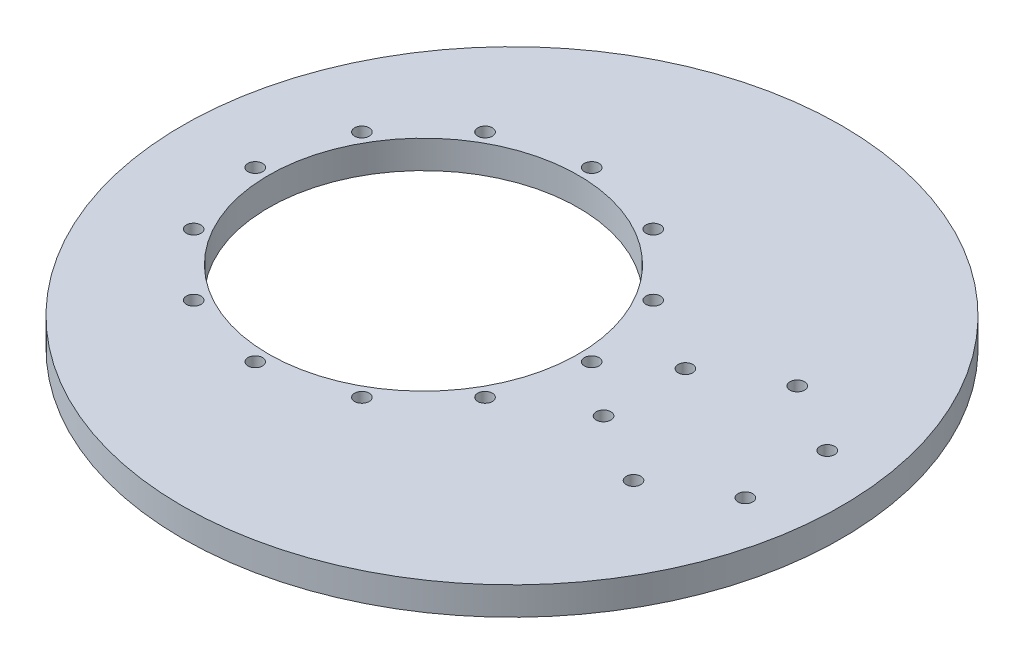
ISO-10303-21;
HEADER;
FILE_DESCRIPTION(('STEP AP214'),'2;1');
FILE_NAME('part.step','',(''),(''),'','','');
FILE_SCHEMA(('AUTOMOTIVE_DESIGN { 1 0 10303 214 1 1 1 1 }'));
ENDSEC;
DATA;
#1=APPLICATION_CONTEXT('core data for automotive mechanical design processes');
#2=APPLICATION_PROTOCOL_DEFINITION('international standard','automotive_design',2000,#1);
#3=PRODUCT_CONTEXT('',#1,'mechanical');
#4=PRODUCT('Part','Part','',(#3));
#5=PRODUCT_RELATED_PRODUCT_CATEGORY('part','',(#4));
#6=PRODUCT_DEFINITION_FORMATION('','',#4);
#7=PRODUCT_DEFINITION_CONTEXT('part definition',#1,'design');
#8=PRODUCT_DEFINITION('design','',#6,#7);
#9=PRODUCT_DEFINITION_SHAPE('','',#8);
#10=(LENGTH_UNIT() NAMED_UNIT(*) SI_UNIT(.MILLI.,.METRE.));
#11=(NAMED_UNIT(*) PLANE_ANGLE_UNIT() SI_UNIT($,.RADIAN.));
#12=(NAMED_UNIT(*) SI_UNIT($,.STERADIAN.) SOLID_ANGLE_UNIT());
#13=UNCERTAINTY_MEASURE_WITH_UNIT(LENGTH_MEASURE(1.E-05),#10,'distance_accuracy_value','');
#14=(GEOMETRIC_REPRESENTATION_CONTEXT(3) GLOBAL_UNCERTAINTY_ASSIGNED_CONTEXT((#13)) GLOBAL_UNIT_ASSIGNED_CONTEXT((#10,
#11,#12)) REPRESENTATION_CONTEXT('',''));
#15=CARTESIAN_POINT('',(0.,0.,0.));
#16=DIRECTION('',(0.,0.,1.));
#17=DIRECTION('',(1.,0.,0.));
#18=AXIS2_PLACEMENT_3D('',#15,#16,#17);
#19=CARTESIAN_POINT('',(0.,6.35,0.));
#20=DIRECTION('',(0.,-1.,0.));
#21=DIRECTION('',(0.,0.,-1.));
#22=AXIS2_PLACEMENT_3D('',#19,#20,#21);
#23=CYLINDRICAL_SURFACE('',#22,35.);
#24=CARTESIAN_POINT('',(0.,6.35,0.));
#25=DIRECTION('',(0.,1.,0.));
#26=DIRECTION('',(0.,0.,1.));
#27=AXIS2_PLACEMENT_3D('',#24,#25,#26);
#28=CIRCLE('',#27,35.);
#29=CARTESIAN_POINT('',(0.,6.35,35.));
#30=VERTEX_POINT('',#29);
#31=EDGE_CURVE('E48',#30,#30,#28,.T.);
#32=ORIENTED_EDGE('',*,*,#31,.T.);
#33=EDGE_LOOP('',(#32));
#34=FACE_BOUND('',#33,.T.);
#35=CARTESIAN_POINT('',(0.,0.,0.));
#36=DIRECTION('',(0.,1.,0.));
#37=DIRECTION('',(0.,0.,1.));
#38=AXIS2_PLACEMENT_3D('',#35,#36,#37);
#39=CIRCLE('',#38,35.);
#40=CARTESIAN_POINT('',(0.,0.,35.));
#41=VERTEX_POINT('',#40);
#42=EDGE_CURVE('E55',#41,#41,#39,.T.);
#43=ORIENTED_EDGE('',*,*,#42,.F.);
#44=EDGE_LOOP('',(#43));
#45=FACE_BOUND('',#44,.T.);
#46=ADVANCED_FACE('F41',(#34,#45),#23,.F.);
#47=CARTESIAN_POINT('',(20.,6.35,0.));
#48=DIRECTION('',(0.,-1.,0.));
#49=DIRECTION('',(0.,0.,-1.));
#50=AXIS2_PLACEMENT_3D('',#47,#48,#49);
#51=CYLINDRICAL_SURFACE('',#50,74.45);
#52=CARTESIAN_POINT('',(20.,6.35,0.));
#53=DIRECTION('',(0.,1.,0.));
#54=DIRECTION('',(0.,0.,1.));
#55=AXIS2_PLACEMENT_3D('',#52,#53,#54);
#56=CIRCLE('',#55,74.45);
#57=CARTESIAN_POINT('',(20.,6.35,74.45));
#58=VERTEX_POINT('',#57);
#59=EDGE_CURVE('E10',#58,#58,#56,.T.);
#60=ORIENTED_EDGE('',*,*,#59,.F.);
#61=EDGE_LOOP('',(#60));
#62=FACE_BOUND('',#61,.T.);
#63=CARTESIAN_POINT('',(20.,0.,0.));
#64=DIRECTION('',(0.,1.,0.));
#65=DIRECTION('',(0.,0.,1.));
#66=AXIS2_PLACEMENT_3D('',#63,#64,#65);
#67=CIRCLE('',#66,74.45);
#68=CARTESIAN_POINT('',(20.,0.,74.45));
#69=VERTEX_POINT('',#68);
#70=EDGE_CURVE('E44',#69,#69,#67,.T.);
#71=ORIENTED_EDGE('',*,*,#70,.T.);
#72=EDGE_LOOP('',(#71));
#73=FACE_BOUND('',#72,.T.);
#74=ADVANCED_FACE('F213',(#62,#73),#51,.T.);
#75=CARTESIAN_POINT('',(0.,6.35,0.));
#76=DIRECTION('',(0.,1.,0.));
#77=DIRECTION('',(0.,0.,1.));
#78=AXIS2_PLACEMENT_3D('',#75,#76,#77);
#79=PLANE('',#78);
#80=CARTESIAN_POINT('',(0.,6.35,-38.));
#81=DIRECTION('',(0.,-1.,0.));
#82=DIRECTION('',(0.,0.,-1.));
#83=AXIS2_PLACEMENT_3D('',#80,#81,#82);
#84=CIRCLE('',#83,1.65);
#85=CARTESIAN_POINT('',(0.,6.35,-39.65));
#86=VERTEX_POINT('',#85);
#87=EDGE_CURVE('E164',#86,#86,#84,.T.);
#88=ORIENTED_EDGE('',*,*,#87,.T.);
#89=EDGE_LOOP('',(#88));
#90=FACE_BOUND('',#89,.T.);
#91=CARTESIAN_POINT('',(-19.,6.35,-32.9089653438087));
#92=DIRECTION('',(0.,-1.,0.));
#93=DIRECTION('',(0.,0.,-1.));
#94=AXIS2_PLACEMENT_3D('',#91,#92,#93);
#95=CIRCLE('',#94,1.65);
#96=CARTESIAN_POINT('',(-19.,6.35,-34.5589653438087));
#97=VERTEX_POINT('',#96);
#98=EDGE_CURVE('E158',#97,#97,#95,.T.);
#99=ORIENTED_EDGE('',*,*,#98,.T.);
#100=EDGE_LOOP('',(#99));
#101=FACE_BOUND('',#100,.T.);
#102=CARTESIAN_POINT('',(-32.9089653438087,6.35,-19.));
#103=DIRECTION('',(0.,-1.,0.));
#104=DIRECTION('',(0.,0.,-1.));
#105=AXIS2_PLACEMENT_3D('',#102,#103,#104);
#106=CIRCLE('',#105,1.65);
#107=CARTESIAN_POINT('',(-32.9089653438087,6.35,-20.65));
#108=VERTEX_POINT('',#107);
#109=EDGE_CURVE('E152',#108,#108,#106,.T.);
#110=ORIENTED_EDGE('',*,*,#109,.T.);
#111=EDGE_LOOP('',(#110));
#112=FACE_BOUND('',#111,.T.);
#113=CARTESIAN_POINT('',(-38.,6.35,0.));
#114=DIRECTION('',(0.,-1.,0.));
#115=DIRECTION('',(0.,0.,-1.));
#116=AXIS2_PLACEMENT_3D('',#113,#114,#115);
#117=CIRCLE('',#116,1.65);
#118=CARTESIAN_POINT('',(-38.,6.35,-1.64999999999999));
#119=VERTEX_POINT('',#118);
#120=EDGE_CURVE('E146',#119,#119,#117,.T.);
#121=ORIENTED_EDGE('',*,*,#120,.T.);
#122=EDGE_LOOP('',(#121));
#123=FACE_BOUND('',#122,.T.);
#124=CARTESIAN_POINT('',(-32.9089653438087,6.35,19.));
#125=DIRECTION('',(0.,-1.,0.));
#126=DIRECTION('',(0.,0.,-1.));
#127=AXIS2_PLACEMENT_3D('',#124,#125,#126);
#128=CIRCLE('',#127,1.65);
#129=CARTESIAN_POINT('',(-32.9089653438087,6.35,17.35));
#130=VERTEX_POINT('',#129);
#131=EDGE_CURVE('E140',#130,#130,#128,.T.);
#132=ORIENTED_EDGE('',*,*,#131,.T.);
#133=EDGE_LOOP('',(#132));
#134=FACE_BOUND('',#133,.T.);
#135=CARTESIAN_POINT('',(-19.,6.35,32.9089653438087));
#136=DIRECTION('',(0.,-1.,0.));
#137=DIRECTION('',(0.,0.,-1.));
#138=AXIS2_PLACEMENT_3D('',#135,#136,#137);
#139=CIRCLE('',#138,1.65);
#140=CARTESIAN_POINT('',(-19.,6.35,31.2589653438087));
#141=VERTEX_POINT('',#140);
#142=EDGE_CURVE('E134',#141,#141,#139,.T.);
#143=ORIENTED_EDGE('',*,*,#142,.T.);
#144=EDGE_LOOP('',(#143));
#145=FACE_BOUND('',#144,.T.);
#146=CARTESIAN_POINT('',(0.,6.35,38.));
#147=DIRECTION('',(0.,-1.,0.));
#148=DIRECTION('',(0.,0.,-1.));
#149=AXIS2_PLACEMENT_3D('',#146,#147,#148);
#150=CIRCLE('',#149,1.65);
#151=CARTESIAN_POINT('',(0.,6.35,36.35));
#152=VERTEX_POINT('',#151);
#153=EDGE_CURVE('E128',#152,#152,#150,.T.);
#154=ORIENTED_EDGE('',*,*,#153,.T.);
#155=EDGE_LOOP('',(#154));
#156=FACE_BOUND('',#155,.T.);
#157=CARTESIAN_POINT('',(19.,6.35,32.9089653438087));
#158=DIRECTION('',(0.,-1.,0.));
#159=DIRECTION('',(0.,0.,-1.));
#160=AXIS2_PLACEMENT_3D('',#157,#158,#159);
#161=CIRCLE('',#160,1.65);
#162=CARTESIAN_POINT('',(19.,6.35,31.2589653438087));
#163=VERTEX_POINT('',#162);
#164=EDGE_CURVE('E122',#163,#163,#161,.T.);
#165=ORIENTED_EDGE('',*,*,#164,.T.);
#166=EDGE_LOOP('',(#165));
#167=FACE_BOUND('',#166,.T.);
#168=CARTESIAN_POINT('',(32.9089653438087,6.35,19.));
#169=DIRECTION('',(0.,-1.,0.));
#170=DIRECTION('',(0.,0.,-1.));
#171=AXIS2_PLACEMENT_3D('',#168,#169,#170);
#172=CIRCLE('',#171,1.65);
#173=CARTESIAN_POINT('',(32.9089653438087,6.35,17.35));
#174=VERTEX_POINT('',#173);
#175=EDGE_CURVE('E116',#174,#174,#172,.T.);
#176=ORIENTED_EDGE('',*,*,#175,.T.);
#177=EDGE_LOOP('',(#176));
#178=FACE_BOUND('',#177,.T.);
#179=CARTESIAN_POINT('',(38.,6.35,0.));
#180=DIRECTION('',(0.,-1.,0.));
#181=DIRECTION('',(0.,0.,-1.));
#182=AXIS2_PLACEMENT_3D('',#179,#180,#181);
#183=CIRCLE('',#182,1.65);
#184=CARTESIAN_POINT('',(38.,6.35,-1.65));
#185=VERTEX_POINT('',#184);
#186=EDGE_CURVE('E110',#185,#185,#183,.T.);
#187=ORIENTED_EDGE('',*,*,#186,.T.);
#188=EDGE_LOOP('',(#187));
#189=FACE_BOUND('',#188,.T.);
#190=CARTESIAN_POINT('',(19.,6.35,-32.9089653438087));
#191=DIRECTION('',(0.,-1.,0.));
#192=DIRECTION('',(0.,0.,-1.));
#193=AXIS2_PLACEMENT_3D('',#190,#191,#192);
#194=CIRCLE('',#193,1.65);
#195=CARTESIAN_POINT('',(19.,6.35,-34.5589653438087));
#196=VERTEX_POINT('',#195);
#197=EDGE_CURVE('E104',#196,#196,#194,.T.);
#198=ORIENTED_EDGE('',*,*,#197,.T.);
#199=EDGE_LOOP('',(#198));
#200=FACE_BOUND('',#199,.T.);
#201=CARTESIAN_POINT('',(32.9089653438087,6.35,-19.));
#202=DIRECTION('',(0.,-1.,0.));
#203=DIRECTION('',(0.,0.,-1.));
#204=AXIS2_PLACEMENT_3D('',#201,#202,#203);
#205=CIRCLE('',#204,1.65);
#206=CARTESIAN_POINT('',(32.9089653438087,6.35,-20.65));
#207=VERTEX_POINT('',#206);
#208=EDGE_CURVE('E98',#207,#207,#205,.T.);
#209=ORIENTED_EDGE('',*,*,#208,.T.);
#210=EDGE_LOOP('',(#209));
#211=FACE_BOUND('',#210,.T.);
#212=CARTESIAN_POINT('',(65.95,6.35,-18.5));
#213=DIRECTION('',(0.,1.,0.));
#214=DIRECTION('',(0.,0.,1.));
#215=AXIS2_PLACEMENT_3D('',#212,#213,#214);
#216=CIRCLE('',#215,1.65);
#217=CARTESIAN_POINT('',(65.95,6.35,-16.85));
#218=VERTEX_POINT('',#217);
#219=EDGE_CURVE('E95',#218,#218,#216,.T.);
#220=ORIENTED_EDGE('',*,*,#219,.F.);
#221=EDGE_LOOP('',(#220));
#222=FACE_BOUND('',#221,.T.);
#223=CARTESIAN_POINT('',(81.9714699700121,6.35,-9.25000000000002));
#224=DIRECTION('',(0.,1.,0.));
#225=DIRECTION('',(0.,0.,1.));
#226=AXIS2_PLACEMENT_3D('',#223,#224,#225);
#227=CIRCLE('',#226,1.65);
#228=CARTESIAN_POINT('',(81.9714699700121,6.35,-7.60000000000002));
#229=VERTEX_POINT('',#228);
#230=EDGE_CURVE('E89',#229,#229,#227,.T.);
#231=ORIENTED_EDGE('',*,*,#230,.F.);
#232=EDGE_LOOP('',(#231));
#233=FACE_BOUND('',#232,.T.);
#234=CARTESIAN_POINT('',(81.9714699700121,6.35,9.25000000000002));
#235=DIRECTION('',(0.,1.,0.));
#236=DIRECTION('',(0.,0.,1.));
#237=AXIS2_PLACEMENT_3D('',#234,#235,#236);
#238=CIRCLE('',#237,1.65);
#239=CARTESIAN_POINT('',(81.9714699700121,6.35,10.9));
#240=VERTEX_POINT('',#239);
#241=EDGE_CURVE('E83',#240,#240,#238,.T.);
#242=ORIENTED_EDGE('',*,*,#241,.F.);
#243=EDGE_LOOP('',(#242));
#244=FACE_BOUND('',#243,.T.);
#245=CARTESIAN_POINT('',(65.95,6.35,18.5));
#246=DIRECTION('',(0.,1.,0.));
#247=DIRECTION('',(0.,0.,1.));
#248=AXIS2_PLACEMENT_3D('',#245,#246,#247);
#249=CIRCLE('',#248,1.65);
#250=CARTESIAN_POINT('',(65.95,6.35,20.15));
#251=VERTEX_POINT('',#250);
#252=EDGE_CURVE('E77',#251,#251,#249,.T.);
#253=ORIENTED_EDGE('',*,*,#252,.F.);
#254=EDGE_LOOP('',(#253));
#255=FACE_BOUND('',#254,.T.);
#256=CARTESIAN_POINT('',(49.9285300299878,6.35,9.24999999999991));
#257=DIRECTION('',(0.,1.,0.));
#258=DIRECTION('',(0.,0.,1.));
#259=AXIS2_PLACEMENT_3D('',#256,#257,#258);
#260=CIRCLE('',#259,1.65);
#261=CARTESIAN_POINT('',(49.9285300299878,6.35,10.8999999999999));
#262=VERTEX_POINT('',#261);
#263=EDGE_CURVE('E71',#262,#262,#260,.T.);
#264=ORIENTED_EDGE('',*,*,#263,.F.);
#265=EDGE_LOOP('',(#264));
#266=FACE_BOUND('',#265,.T.);
#267=CARTESIAN_POINT('',(49.9285300299878,6.35,-9.2499999999999));
#268=DIRECTION('',(0.,1.,0.));
#269=DIRECTION('',(0.,0.,1.));
#270=AXIS2_PLACEMENT_3D('',#267,#268,#269);
#271=CIRCLE('',#270,1.65);
#272=CARTESIAN_POINT('',(49.9285300299878,6.35,-7.5999999999999));
#273=VERTEX_POINT('',#272);
#274=EDGE_CURVE('E62',#273,#273,#271,.T.);
#275=ORIENTED_EDGE('',*,*,#274,.F.);
#276=EDGE_LOOP('',(#275));
#277=FACE_BOUND('',#276,.T.);
#278=ORIENTED_EDGE('',*,*,#31,.F.);
#279=EDGE_LOOP('',(#278));
#280=FACE_BOUND('',#279,.T.);
#281=ORIENTED_EDGE('',*,*,#59,.T.);
#282=EDGE_LOOP('',(#281));
#283=FACE_BOUND('',#282,.T.);
#284=ADVANCED_FACE('F177',(#90,#101,#112,#123,#134,#145,#156,#167,#178,#189,#200,#211,#222,#233,
#244,#255,#266,#277,#280,#283),#79,.T.);
#285=CARTESIAN_POINT('',(0.,0.,0.));
#286=DIRECTION('',(0.,1.,0.));
#287=DIRECTION('',(0.,0.,1.));
#288=AXIS2_PLACEMENT_3D('',#285,#286,#287);
#289=PLANE('',#288);
#290=CARTESIAN_POINT('',(0.,0.,-38.));
#291=DIRECTION('',(0.,-1.,0.));
#292=DIRECTION('',(0.,0.,-1.));
#293=AXIS2_PLACEMENT_3D('',#290,#291,#292);
#294=CIRCLE('',#293,1.65);
#295=CARTESIAN_POINT('',(0.,0.,-39.65));
#296=VERTEX_POINT('',#295);
#297=EDGE_CURVE('E167',#296,#296,#294,.T.);
#298=ORIENTED_EDGE('',*,*,#297,.F.);
#299=EDGE_LOOP('',(#298));
#300=FACE_BOUND('',#299,.T.);
#301=CARTESIAN_POINT('',(-19.,0.,-32.9089653438087));
#302=DIRECTION('',(0.,-1.,0.));
#303=DIRECTION('',(0.,0.,-1.));
#304=AXIS2_PLACEMENT_3D('',#301,#302,#303);
#305=CIRCLE('',#304,1.65);
#306=CARTESIAN_POINT('',(-19.,0.,-34.5589653438087));
#307=VERTEX_POINT('',#306);
#308=EDGE_CURVE('E161',#307,#307,#305,.T.);
#309=ORIENTED_EDGE('',*,*,#308,.F.);
#310=EDGE_LOOP('',(#309));
#311=FACE_BOUND('',#310,.T.);
#312=CARTESIAN_POINT('',(-32.9089653438087,0.,-19.));
#313=DIRECTION('',(0.,-1.,0.));
#314=DIRECTION('',(0.,0.,-1.));
#315=AXIS2_PLACEMENT_3D('',#312,#313,#314);
#316=CIRCLE('',#315,1.65);
#317=CARTESIAN_POINT('',(-32.9089653438087,0.,-20.65));
#318=VERTEX_POINT('',#317);
#319=EDGE_CURVE('E155',#318,#318,#316,.T.);
#320=ORIENTED_EDGE('',*,*,#319,.F.);
#321=EDGE_LOOP('',(#320));
#322=FACE_BOUND('',#321,.T.);
#323=CARTESIAN_POINT('',(-38.,0.,0.));
#324=DIRECTION('',(0.,-1.,0.));
#325=DIRECTION('',(0.,0.,-1.));
#326=AXIS2_PLACEMENT_3D('',#323,#324,#325);
#327=CIRCLE('',#326,1.65);
#328=CARTESIAN_POINT('',(-38.,0.,-1.64999999999999));
#329=VERTEX_POINT('',#328);
#330=EDGE_CURVE('E149',#329,#329,#327,.T.);
#331=ORIENTED_EDGE('',*,*,#330,.F.);
#332=EDGE_LOOP('',(#331));
#333=FACE_BOUND('',#332,.T.);
#334=CARTESIAN_POINT('',(-32.9089653438087,0.,19.));
#335=DIRECTION('',(0.,-1.,0.));
#336=DIRECTION('',(0.,0.,-1.));
#337=AXIS2_PLACEMENT_3D('',#334,#335,#336);
#338=CIRCLE('',#337,1.65);
#339=CARTESIAN_POINT('',(-32.9089653438087,0.,17.35));
#340=VERTEX_POINT('',#339);
#341=EDGE_CURVE('E143',#340,#340,#338,.T.);
#342=ORIENTED_EDGE('',*,*,#341,.F.);
#343=EDGE_LOOP('',(#342));
#344=FACE_BOUND('',#343,.T.);
#345=CARTESIAN_POINT('',(-19.,0.,32.9089653438087));
#346=DIRECTION('',(0.,-1.,0.));
#347=DIRECTION('',(0.,0.,-1.));
#348=AXIS2_PLACEMENT_3D('',#345,#346,#347);
#349=CIRCLE('',#348,1.65);
#350=CARTESIAN_POINT('',(-19.,0.,31.2589653438087));
#351=VERTEX_POINT('',#350);
#352=EDGE_CURVE('E137',#351,#351,#349,.T.);
#353=ORIENTED_EDGE('',*,*,#352,.F.);
#354=EDGE_LOOP('',(#353));
#355=FACE_BOUND('',#354,.T.);
#356=CARTESIAN_POINT('',(0.,0.,38.));
#357=DIRECTION('',(0.,-1.,0.));
#358=DIRECTION('',(0.,0.,-1.));
#359=AXIS2_PLACEMENT_3D('',#356,#357,#358);
#360=CIRCLE('',#359,1.65);
#361=CARTESIAN_POINT('',(0.,0.,36.35));
#362=VERTEX_POINT('',#361);
#363=EDGE_CURVE('E131',#362,#362,#360,.T.);
#364=ORIENTED_EDGE('',*,*,#363,.F.);
#365=EDGE_LOOP('',(#364));
#366=FACE_BOUND('',#365,.T.);
#367=CARTESIAN_POINT('',(19.,0.,32.9089653438087));
#368=DIRECTION('',(0.,-1.,0.));
#369=DIRECTION('',(0.,0.,-1.));
#370=AXIS2_PLACEMENT_3D('',#367,#368,#369);
#371=CIRCLE('',#370,1.65);
#372=CARTESIAN_POINT('',(19.,0.,31.2589653438087));
#373=VERTEX_POINT('',#372);
#374=EDGE_CURVE('E125',#373,#373,#371,.T.);
#375=ORIENTED_EDGE('',*,*,#374,.F.);
#376=EDGE_LOOP('',(#375));
#377=FACE_BOUND('',#376,.T.);
#378=CARTESIAN_POINT('',(32.9089653438087,0.,19.));
#379=DIRECTION('',(0.,-1.,0.));
#380=DIRECTION('',(0.,0.,-1.));
#381=AXIS2_PLACEMENT_3D('',#378,#379,#380);
#382=CIRCLE('',#381,1.65);
#383=CARTESIAN_POINT('',(32.9089653438087,0.,17.35));
#384=VERTEX_POINT('',#383);
#385=EDGE_CURVE('E119',#384,#384,#382,.T.);
#386=ORIENTED_EDGE('',*,*,#385,.F.);
#387=EDGE_LOOP('',(#386));
#388=FACE_BOUND('',#387,.T.);
#389=CARTESIAN_POINT('',(38.,0.,0.));
#390=DIRECTION('',(0.,-1.,0.));
#391=DIRECTION('',(0.,0.,-1.));
#392=AXIS2_PLACEMENT_3D('',#389,#390,#391);
#393=CIRCLE('',#392,1.65);
#394=CARTESIAN_POINT('',(38.,0.,-1.65));
#395=VERTEX_POINT('',#394);
#396=EDGE_CURVE('E113',#395,#395,#393,.T.);
#397=ORIENTED_EDGE('',*,*,#396,.F.);
#398=EDGE_LOOP('',(#397));
#399=FACE_BOUND('',#398,.T.);
#400=CARTESIAN_POINT('',(19.,0.,-32.9089653438087));
#401=DIRECTION('',(0.,-1.,0.));
#402=DIRECTION('',(0.,0.,-1.));
#403=AXIS2_PLACEMENT_3D('',#400,#401,#402);
#404=CIRCLE('',#403,1.65);
#405=CARTESIAN_POINT('',(19.,0.,-34.5589653438087));
#406=VERTEX_POINT('',#405);
#407=EDGE_CURVE('E107',#406,#406,#404,.T.);
#408=ORIENTED_EDGE('',*,*,#407,.F.);
#409=EDGE_LOOP('',(#408));
#410=FACE_BOUND('',#409,.T.);
#411=CARTESIAN_POINT('',(32.9089653438087,0.,-19.));
#412=DIRECTION('',(0.,-1.,0.));
#413=DIRECTION('',(0.,0.,-1.));
#414=AXIS2_PLACEMENT_3D('',#411,#412,#413);
#415=CIRCLE('',#414,1.65);
#416=CARTESIAN_POINT('',(32.9089653438087,0.,-20.65));
#417=VERTEX_POINT('',#416);
#418=EDGE_CURVE('E101',#417,#417,#415,.T.);
#419=ORIENTED_EDGE('',*,*,#418,.F.);
#420=EDGE_LOOP('',(#419));
#421=FACE_BOUND('',#420,.T.);
#422=CARTESIAN_POINT('',(65.95,0.,-18.5));
#423=DIRECTION('',(0.,1.,0.));
#424=DIRECTION('',(0.,0.,1.));
#425=AXIS2_PLACEMENT_3D('',#422,#423,#424);
#426=CIRCLE('',#425,1.65);
#427=CARTESIAN_POINT('',(65.95,0.,-16.85));
#428=VERTEX_POINT('',#427);
#429=EDGE_CURVE('E92',#428,#428,#426,.T.);
#430=ORIENTED_EDGE('',*,*,#429,.T.);
#431=EDGE_LOOP('',(#430));
#432=FACE_BOUND('',#431,.T.);
#433=CARTESIAN_POINT('',(81.9714699700121,0.,-9.25000000000002));
#434=DIRECTION('',(0.,1.,0.));
#435=DIRECTION('',(0.,0.,1.));
#436=AXIS2_PLACEMENT_3D('',#433,#434,#435);
#437=CIRCLE('',#436,1.65);
#438=CARTESIAN_POINT('',(81.9714699700121,0.,-7.60000000000002));
#439=VERTEX_POINT('',#438);
#440=EDGE_CURVE('E86',#439,#439,#437,.T.);
#441=ORIENTED_EDGE('',*,*,#440,.T.);
#442=EDGE_LOOP('',(#441));
#443=FACE_BOUND('',#442,.T.);
#444=CARTESIAN_POINT('',(81.9714699700121,0.,9.25000000000002));
#445=DIRECTION('',(0.,1.,0.));
#446=DIRECTION('',(0.,0.,1.));
#447=AXIS2_PLACEMENT_3D('',#444,#445,#446);
#448=CIRCLE('',#447,1.65);
#449=CARTESIAN_POINT('',(81.9714699700121,0.,10.9));
#450=VERTEX_POINT('',#449);
#451=EDGE_CURVE('E80',#450,#450,#448,.T.);
#452=ORIENTED_EDGE('',*,*,#451,.T.);
#453=EDGE_LOOP('',(#452));
#454=FACE_BOUND('',#453,.T.);
#455=CARTESIAN_POINT('',(65.95,0.,18.5));
#456=DIRECTION('',(0.,1.,0.));
#457=DIRECTION('',(0.,0.,1.));
#458=AXIS2_PLACEMENT_3D('',#455,#456,#457);
#459=CIRCLE('',#458,1.65);
#460=CARTESIAN_POINT('',(65.95,0.,20.15));
#461=VERTEX_POINT('',#460);
#462=EDGE_CURVE('E74',#461,#461,#459,.T.);
#463=ORIENTED_EDGE('',*,*,#462,.T.);
#464=EDGE_LOOP('',(#463));
#465=FACE_BOUND('',#464,.T.);
#466=CARTESIAN_POINT('',(49.9285300299878,0.,9.24999999999991));
#467=DIRECTION('',(0.,1.,0.));
#468=DIRECTION('',(0.,0.,1.));
#469=AXIS2_PLACEMENT_3D('',#466,#467,#468);
#470=CIRCLE('',#469,1.65);
#471=CARTESIAN_POINT('',(49.9285300299878,0.,10.8999999999999));
#472=VERTEX_POINT('',#471);
#473=EDGE_CURVE('E66',#472,#472,#470,.T.);
#474=ORIENTED_EDGE('',*,*,#473,.T.);
#475=EDGE_LOOP('',(#474));
#476=FACE_BOUND('',#475,.T.);
#477=CARTESIAN_POINT('',(49.9285300299878,0.,-9.2499999999999));
#478=DIRECTION('',(0.,1.,0.));
#479=DIRECTION('',(0.,0.,1.));
#480=AXIS2_PLACEMENT_3D('',#477,#478,#479);
#481=CIRCLE('',#480,1.65);
#482=CARTESIAN_POINT('',(49.9285300299878,0.,-7.5999999999999));
#483=VERTEX_POINT('',#482);
#484=EDGE_CURVE('E57',#483,#483,#481,.T.);
#485=ORIENTED_EDGE('',*,*,#484,.T.);
#486=EDGE_LOOP('',(#485));
#487=FACE_BOUND('',#486,.T.);
#488=ORIENTED_EDGE('',*,*,#42,.T.);
#489=EDGE_LOOP('',(#488));
#490=FACE_BOUND('',#489,.T.);
#491=ORIENTED_EDGE('',*,*,#70,.F.);
#492=EDGE_LOOP('',(#491));
#493=FACE_BOUND('',#492,.T.);
#494=ADVANCED_FACE('F173',(#300,#311,#322,#333,#344,#355,#366,#377,#388,#399,#410,#421,#432,
#443,#454,#465,#476,#487,#490,#493),#289,.F.);
#495=CARTESIAN_POINT('',(49.9285300299878,6.35,-9.2499999999999));
#496=DIRECTION('',(0.,1.,0.));
#497=DIRECTION('',(0.,0.,1.));
#498=AXIS2_PLACEMENT_3D('',#495,#496,#497);
#499=CYLINDRICAL_SURFACE('',#498,1.65);
#500=ORIENTED_EDGE('',*,*,#484,.F.);
#501=EDGE_LOOP('',(#500));
#502=FACE_BOUND('',#501,.T.);
#503=ORIENTED_EDGE('',*,*,#274,.T.);
#504=EDGE_LOOP('',(#503));
#505=FACE_BOUND('',#504,.T.);
#506=ADVANCED_FACE('F176',(#502,#505),#499,.F.);
#507=CARTESIAN_POINT('',(49.9285300299878,6.35,9.24999999999991));
#508=DIRECTION('',(0.,1.,0.));
#509=DIRECTION('',(0.,0.,1.));
#510=AXIS2_PLACEMENT_3D('',#507,#508,#509);
#511=CYLINDRICAL_SURFACE('',#510,1.65);
#512=ORIENTED_EDGE('',*,*,#473,.F.);
#513=EDGE_LOOP('',(#512));
#514=FACE_BOUND('',#513,.T.);
#515=ORIENTED_EDGE('',*,*,#263,.T.);
#516=EDGE_LOOP('',(#515));
#517=FACE_BOUND('',#516,.T.);
#518=ADVANCED_FACE('F226',(#514,#517),#511,.F.);
#519=CARTESIAN_POINT('',(65.95,6.35,18.5));
#520=DIRECTION('',(0.,1.,0.));
#521=DIRECTION('',(0.,0.,1.));
#522=AXIS2_PLACEMENT_3D('',#519,#520,#521);
#523=CYLINDRICAL_SURFACE('',#522,1.65);
#524=ORIENTED_EDGE('',*,*,#462,.F.);
#525=EDGE_LOOP('',(#524));
#526=FACE_BOUND('',#525,.T.);
#527=ORIENTED_EDGE('',*,*,#252,.T.);
#528=EDGE_LOOP('',(#527));
#529=FACE_BOUND('',#528,.T.);
#530=ADVANCED_FACE('F230',(#526,#529),#523,.F.);
#531=CARTESIAN_POINT('',(81.9714699700121,6.35,9.25000000000002));
#532=DIRECTION('',(0.,1.,0.));
#533=DIRECTION('',(0.,0.,1.));
#534=AXIS2_PLACEMENT_3D('',#531,#532,#533);
#535=CYLINDRICAL_SURFACE('',#534,1.65);
#536=ORIENTED_EDGE('',*,*,#451,.F.);
#537=EDGE_LOOP('',(#536));
#538=FACE_BOUND('',#537,.T.);
#539=ORIENTED_EDGE('',*,*,#241,.T.);
#540=EDGE_LOOP('',(#539));
#541=FACE_BOUND('',#540,.T.);
#542=ADVANCED_FACE('F234',(#538,#541),#535,.F.);
#543=CARTESIAN_POINT('',(81.9714699700121,6.35,-9.25000000000002));
#544=DIRECTION('',(0.,1.,0.));
#545=DIRECTION('',(0.,0.,1.));
#546=AXIS2_PLACEMENT_3D('',#543,#544,#545);
#547=CYLINDRICAL_SURFACE('',#546,1.65);
#548=ORIENTED_EDGE('',*,*,#440,.F.);
#549=EDGE_LOOP('',(#548));
#550=FACE_BOUND('',#549,.T.);
#551=ORIENTED_EDGE('',*,*,#230,.T.);
#552=EDGE_LOOP('',(#551));
#553=FACE_BOUND('',#552,.T.);
#554=ADVANCED_FACE('F238',(#550,#553),#547,.F.);
#555=CARTESIAN_POINT('',(65.95,6.35,-18.5));
#556=DIRECTION('',(0.,1.,0.));
#557=DIRECTION('',(0.,0.,1.));
#558=AXIS2_PLACEMENT_3D('',#555,#556,#557);
#559=CYLINDRICAL_SURFACE('',#558,1.65);
#560=ORIENTED_EDGE('',*,*,#429,.F.);
#561=EDGE_LOOP('',(#560));
#562=FACE_BOUND('',#561,.T.);
#563=ORIENTED_EDGE('',*,*,#219,.T.);
#564=EDGE_LOOP('',(#563));
#565=FACE_BOUND('',#564,.T.);
#566=ADVANCED_FACE('F242',(#562,#565),#559,.F.);
#567=CARTESIAN_POINT('',(32.9089653438087,0.,-19.));
#568=DIRECTION('',(0.,-1.,0.));
#569=DIRECTION('',(0.,0.,-1.));
#570=AXIS2_PLACEMENT_3D('',#567,#568,#569);
#571=CYLINDRICAL_SURFACE('',#570,1.65);
#572=ORIENTED_EDGE('',*,*,#208,.F.);
#573=EDGE_LOOP('',(#572));
#574=FACE_BOUND('',#573,.T.);
#575=ORIENTED_EDGE('',*,*,#418,.T.);
#576=EDGE_LOOP('',(#575));
#577=FACE_BOUND('',#576,.T.);
#578=ADVANCED_FACE('F246',(#574,#577),#571,.F.);
#579=CARTESIAN_POINT('',(19.,0.,-32.9089653438087));
#580=DIRECTION('',(0.,-1.,0.));
#581=DIRECTION('',(0.,0.,-1.));
#582=AXIS2_PLACEMENT_3D('',#579,#580,#581);
#583=CYLINDRICAL_SURFACE('',#582,1.65);
#584=ORIENTED_EDGE('',*,*,#197,.F.);
#585=EDGE_LOOP('',(#584));
#586=FACE_BOUND('',#585,.T.);
#587=ORIENTED_EDGE('',*,*,#407,.T.);
#588=EDGE_LOOP('',(#587));
#589=FACE_BOUND('',#588,.T.);
#590=ADVANCED_FACE('F250',(#586,#589),#583,.F.);
#591=CARTESIAN_POINT('',(38.,0.,0.));
#592=DIRECTION('',(0.,-1.,0.));
#593=DIRECTION('',(0.,0.,-1.));
#594=AXIS2_PLACEMENT_3D('',#591,#592,#593);
#595=CYLINDRICAL_SURFACE('',#594,1.65);
#596=ORIENTED_EDGE('',*,*,#186,.F.);
#597=EDGE_LOOP('',(#596));
#598=FACE_BOUND('',#597,.T.);
#599=ORIENTED_EDGE('',*,*,#396,.T.);
#600=EDGE_LOOP('',(#599));
#601=FACE_BOUND('',#600,.T.);
#602=ADVANCED_FACE('F254',(#598,#601),#595,.F.);
#603=CARTESIAN_POINT('',(32.9089653438087,0.,19.));
#604=DIRECTION('',(0.,-1.,0.));
#605=DIRECTION('',(0.,0.,-1.));
#606=AXIS2_PLACEMENT_3D('',#603,#604,#605);
#607=CYLINDRICAL_SURFACE('',#606,1.65);
#608=ORIENTED_EDGE('',*,*,#175,.F.);
#609=EDGE_LOOP('',(#608));
#610=FACE_BOUND('',#609,.T.);
#611=ORIENTED_EDGE('',*,*,#385,.T.);
#612=EDGE_LOOP('',(#611));
#613=FACE_BOUND('',#612,.T.);
#614=ADVANCED_FACE('F258',(#610,#613),#607,.F.);
#615=CARTESIAN_POINT('',(19.,0.,32.9089653438087));
#616=DIRECTION('',(0.,-1.,0.));
#617=DIRECTION('',(0.,0.,-1.));
#618=AXIS2_PLACEMENT_3D('',#615,#616,#617);
#619=CYLINDRICAL_SURFACE('',#618,1.65);
#620=ORIENTED_EDGE('',*,*,#164,.F.);
#621=EDGE_LOOP('',(#620));
#622=FACE_BOUND('',#621,.T.);
#623=ORIENTED_EDGE('',*,*,#374,.T.);
#624=EDGE_LOOP('',(#623));
#625=FACE_BOUND('',#624,.T.);
#626=ADVANCED_FACE('F262',(#622,#625),#619,.F.);
#627=CARTESIAN_POINT('',(0.,0.,38.));
#628=DIRECTION('',(0.,-1.,0.));
#629=DIRECTION('',(0.,0.,-1.));
#630=AXIS2_PLACEMENT_3D('',#627,#628,#629);
#631=CYLINDRICAL_SURFACE('',#630,1.65);
#632=ORIENTED_EDGE('',*,*,#153,.F.);
#633=EDGE_LOOP('',(#632));
#634=FACE_BOUND('',#633,.T.);
#635=ORIENTED_EDGE('',*,*,#363,.T.);
#636=EDGE_LOOP('',(#635));
#637=FACE_BOUND('',#636,.T.);
#638=ADVANCED_FACE('F266',(#634,#637),#631,.F.);
#639=CARTESIAN_POINT('',(-19.,0.,32.9089653438087));
#640=DIRECTION('',(0.,-1.,0.));
#641=DIRECTION('',(0.,0.,-1.));
#642=AXIS2_PLACEMENT_3D('',#639,#640,#641);
#643=CYLINDRICAL_SURFACE('',#642,1.65);
#644=ORIENTED_EDGE('',*,*,#142,.F.);
#645=EDGE_LOOP('',(#644));
#646=FACE_BOUND('',#645,.T.);
#647=ORIENTED_EDGE('',*,*,#352,.T.);
#648=EDGE_LOOP('',(#647));
#649=FACE_BOUND('',#648,.T.);
#650=ADVANCED_FACE('F270',(#646,#649),#643,.F.);
#651=CARTESIAN_POINT('',(-32.9089653438087,0.,19.));
#652=DIRECTION('',(0.,-1.,0.));
#653=DIRECTION('',(0.,0.,-1.));
#654=AXIS2_PLACEMENT_3D('',#651,#652,#653);
#655=CYLINDRICAL_SURFACE('',#654,1.65);
#656=ORIENTED_EDGE('',*,*,#131,.F.);
#657=EDGE_LOOP('',(#656));
#658=FACE_BOUND('',#657,.T.);
#659=ORIENTED_EDGE('',*,*,#341,.T.);
#660=EDGE_LOOP('',(#659));
#661=FACE_BOUND('',#660,.T.);
#662=ADVANCED_FACE('F274',(#658,#661),#655,.F.);
#663=CARTESIAN_POINT('',(-38.,0.,0.));
#664=DIRECTION('',(0.,-1.,0.));
#665=DIRECTION('',(0.,0.,-1.));
#666=AXIS2_PLACEMENT_3D('',#663,#664,#665);
#667=CYLINDRICAL_SURFACE('',#666,1.65);
#668=ORIENTED_EDGE('',*,*,#120,.F.);
#669=EDGE_LOOP('',(#668));
#670=FACE_BOUND('',#669,.T.);
#671=ORIENTED_EDGE('',*,*,#330,.T.);
#672=EDGE_LOOP('',(#671));
#673=FACE_BOUND('',#672,.T.);
#674=ADVANCED_FACE('F278',(#670,#673),#667,.F.);
#675=CARTESIAN_POINT('',(-32.9089653438087,0.,-19.));
#676=DIRECTION('',(0.,-1.,0.));
#677=DIRECTION('',(0.,0.,-1.));
#678=AXIS2_PLACEMENT_3D('',#675,#676,#677);
#679=CYLINDRICAL_SURFACE('',#678,1.65);
#680=ORIENTED_EDGE('',*,*,#109,.F.);
#681=EDGE_LOOP('',(#680));
#682=FACE_BOUND('',#681,.T.);
#683=ORIENTED_EDGE('',*,*,#319,.T.);
#684=EDGE_LOOP('',(#683));
#685=FACE_BOUND('',#684,.T.);
#686=ADVANCED_FACE('F282',(#682,#685),#679,.F.);
#687=CARTESIAN_POINT('',(-19.,0.,-32.9089653438087));
#688=DIRECTION('',(0.,-1.,0.));
#689=DIRECTION('',(0.,0.,-1.));
#690=AXIS2_PLACEMENT_3D('',#687,#688,#689);
#691=CYLINDRICAL_SURFACE('',#690,1.65);
#692=ORIENTED_EDGE('',*,*,#98,.F.);
#693=EDGE_LOOP('',(#692));
#694=FACE_BOUND('',#693,.T.);
#695=ORIENTED_EDGE('',*,*,#308,.T.);
#696=EDGE_LOOP('',(#695));
#697=FACE_BOUND('',#696,.T.);
#698=ADVANCED_FACE('F286',(#694,#697),#691,.F.);
#699=CARTESIAN_POINT('',(0.,0.,-38.));
#700=DIRECTION('',(0.,-1.,0.));
#701=DIRECTION('',(0.,0.,-1.));
#702=AXIS2_PLACEMENT_3D('',#699,#700,#701);
#703=CYLINDRICAL_SURFACE('',#702,1.65);
#704=ORIENTED_EDGE('',*,*,#87,.F.);
#705=EDGE_LOOP('',(#704));
#706=FACE_BOUND('',#705,.T.);
#707=ORIENTED_EDGE('',*,*,#297,.T.);
#708=EDGE_LOOP('',(#707));
#709=FACE_BOUND('',#708,.T.);
#710=ADVANCED_FACE('F171',(#706,#709),#703,.F.);
#711=CLOSED_SHELL('',(#46,#74,#284,#494,#506,#518,#530,#542,#554,#566,#578,#590,#602,#614,#626,
#638,#650,#662,#674,#686,#698,#710));
#712=MANIFOLD_SOLID_BREP('B2',#711);
#713=ADVANCED_BREP_SHAPE_REPRESENTATION('',(#18,#712),#14);
#714=SHAPE_DEFINITION_REPRESENTATION(#9,#713);
ENDSEC;
END-ISO-10303-21;
